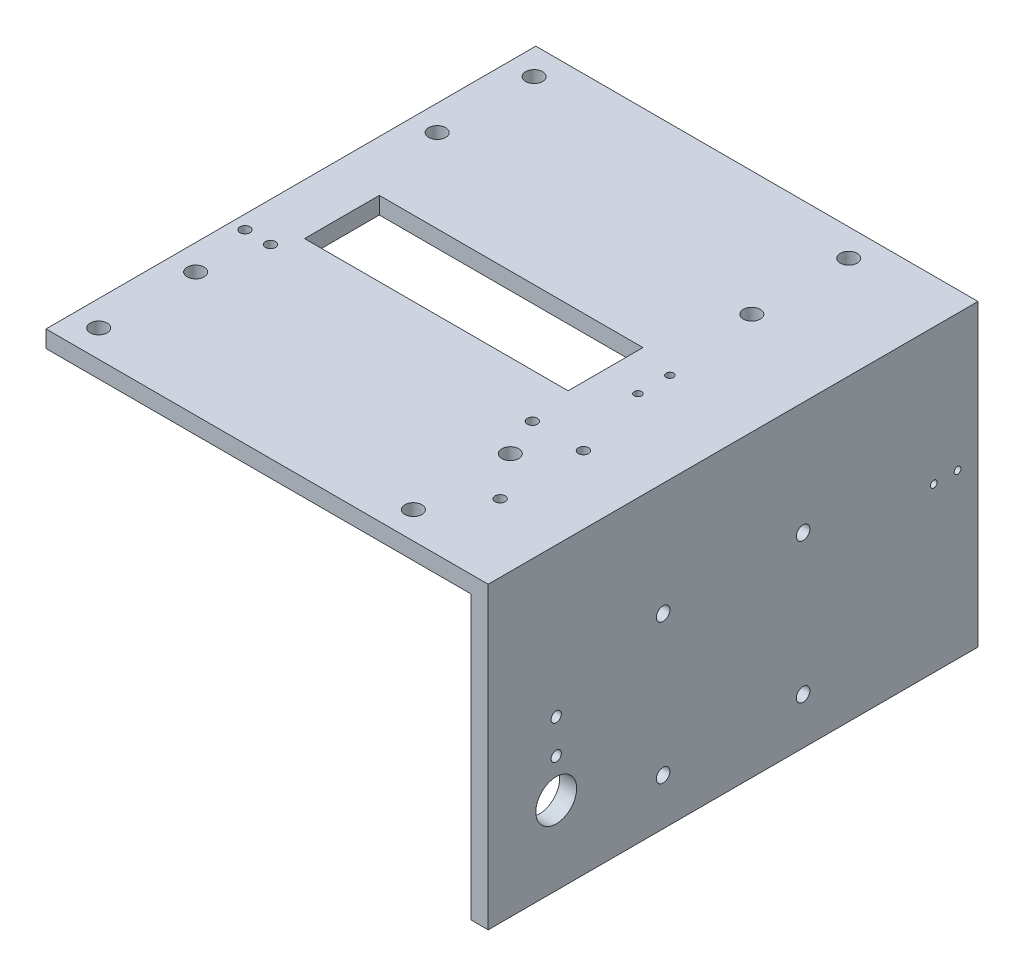
ISO-10303-21;
HEADER;
FILE_DESCRIPTION(('STEP AP214'),'2;1');
FILE_NAME('part.step','',(''),(''),'','','');
FILE_SCHEMA(('AUTOMOTIVE_DESIGN { 1 0 10303 214 1 1 1 1 }'));
ENDSEC;
DATA;
#1=APPLICATION_CONTEXT('core data for automotive mechanical design processes');
#2=APPLICATION_PROTOCOL_DEFINITION('international standard','automotive_design',2000,#1);
#3=PRODUCT_CONTEXT('',#1,'mechanical');
#4=PRODUCT('Part','Part','',(#3));
#5=PRODUCT_RELATED_PRODUCT_CATEGORY('part','',(#4));
#6=PRODUCT_DEFINITION_FORMATION('','',#4);
#7=PRODUCT_DEFINITION_CONTEXT('part definition',#1,'design');
#8=PRODUCT_DEFINITION('design','',#6,#7);
#9=PRODUCT_DEFINITION_SHAPE('','',#8);
#10=(LENGTH_UNIT() NAMED_UNIT(*) SI_UNIT(.MILLI.,.METRE.));
#11=(NAMED_UNIT(*) PLANE_ANGLE_UNIT() SI_UNIT($,.RADIAN.));
#12=(NAMED_UNIT(*) SI_UNIT($,.STERADIAN.) SOLID_ANGLE_UNIT());
#13=UNCERTAINTY_MEASURE_WITH_UNIT(LENGTH_MEASURE(1.E-05),#10,'distance_accuracy_value','');
#14=(GEOMETRIC_REPRESENTATION_CONTEXT(3) GLOBAL_UNCERTAINTY_ASSIGNED_CONTEXT((#13)) GLOBAL_UNIT_ASSIGNED_CONTEXT((#10,
#11,#12)) REPRESENTATION_CONTEXT('',''));
#15=CARTESIAN_POINT('',(0.,0.,0.));
#16=DIRECTION('',(0.,0.,1.));
#17=DIRECTION('',(1.,0.,0.));
#18=AXIS2_PLACEMENT_3D('',#15,#16,#17);
#19=CARTESIAN_POINT('',(-7.5,46.25,72.));
#20=DIRECTION('',(0.,0.,-1.));
#21=DIRECTION('',(-1.,0.,0.));
#22=AXIS2_PLACEMENT_3D('',#19,#20,#21);
#23=PLANE('',#22);
#24=DIRECTION('',(0.,-1.,0.));
#25=VECTOR('',#24,1.);
#26=CARTESIAN_POINT('',(-122.5,53.75,72.));
#27=LINE('',#26,#25);
#28=CARTESIAN_POINT('',(-122.5,53.75,72.));
#29=VERTEX_POINT('',#28);
#30=CARTESIAN_POINT('',(-122.5,48.75,72.));
#31=VERTEX_POINT('',#30);
#32=EDGE_CURVE('E203',#29,#31,#27,.T.);
#33=ORIENTED_EDGE('',*,*,#32,.T.);
#34=DIRECTION('',(-1.,0.,0.));
#35=VECTOR('',#34,1.);
#36=CARTESIAN_POINT('',(2.50000000000001,48.75,72.));
#37=LINE('',#36,#35);
#38=CARTESIAN_POINT('',(2.50000000000001,48.75,72.));
#39=VERTEX_POINT('',#38);
#40=EDGE_CURVE('E119',#39,#31,#37,.T.);
#41=ORIENTED_EDGE('',*,*,#40,.F.);
#42=DIRECTION('',(0.,1.,0.));
#43=VECTOR('',#42,1.);
#44=CARTESIAN_POINT('',(2.50000000000001,-34.25,72.));
#45=LINE('',#44,#43);
#46=CARTESIAN_POINT('',(2.50000000000001,-34.25,72.));
#47=VERTEX_POINT('',#46);
#48=EDGE_CURVE('E113',#47,#39,#45,.T.);
#49=ORIENTED_EDGE('',*,*,#48,.F.);
#50=DIRECTION('',(-1.,0.,0.));
#51=VECTOR('',#50,1.);
#52=CARTESIAN_POINT('',(42.5,-34.25,72.));
#53=LINE('',#52,#51);
#54=CARTESIAN_POINT('',(7.5,-34.25,72.));
#55=VERTEX_POINT('',#54);
#56=EDGE_CURVE('E124',#55,#47,#53,.T.);
#57=ORIENTED_EDGE('',*,*,#56,.F.);
#58=DIRECTION('',(0.,-1.,0.));
#59=VECTOR('',#58,1.);
#60=CARTESIAN_POINT('',(7.5,46.25,72.));
#61=LINE('',#60,#59);
#62=CARTESIAN_POINT('',(7.5,53.75,72.));
#63=VERTEX_POINT('',#62);
#64=EDGE_CURVE('E11',#63,#55,#61,.T.);
#65=ORIENTED_EDGE('',*,*,#64,.F.);
#66=DIRECTION('',(-1.,0.,0.));
#67=VECTOR('',#66,1.);
#68=CARTESIAN_POINT('',(7.5,53.75,72.));
#69=LINE('',#68,#67);
#70=EDGE_CURVE('E198',#63,#29,#69,.T.);
#71=ORIENTED_EDGE('',*,*,#70,.T.);
#72=EDGE_LOOP('',(#33,#41,#49,#57,#65,#71));
#73=FACE_BOUND('',#72,.T.);
#74=ADVANCED_FACE('F33',(#73),#23,.F.);
#75=CARTESIAN_POINT('',(7.5,46.25,72.));
#76=DIRECTION('',(-1.,0.,0.));
#77=DIRECTION('',(0.,0.,1.));
#78=AXIS2_PLACEMENT_3D('',#75,#76,#77);
#79=PLANE('',#78);
#80=CARTESIAN_POINT('',(7.5,13.75,-59.));
#81=DIRECTION('',(1.,0.,0.));
#82=DIRECTION('',(0.,0.,-1.));
#83=AXIS2_PLACEMENT_3D('',#80,#81,#82);
#84=CIRCLE('',#83,0.999999999999998);
#85=CARTESIAN_POINT('',(7.5,13.75,-60.));
#86=VERTEX_POINT('',#85);
#87=EDGE_CURVE('E226',#86,#86,#84,.T.);
#88=ORIENTED_EDGE('',*,*,#87,.F.);
#89=EDGE_LOOP('',(#88));
#90=FACE_BOUND('',#89,.T.);
#91=CARTESIAN_POINT('',(7.5,13.75,-66.));
#92=DIRECTION('',(1.,0.,0.));
#93=DIRECTION('',(0.,0.,-1.));
#94=AXIS2_PLACEMENT_3D('',#91,#92,#93);
#95=CIRCLE('',#94,0.999999999999998);
#96=CARTESIAN_POINT('',(7.5,13.75,-67.));
#97=VERTEX_POINT('',#96);
#98=EDGE_CURVE('E232',#97,#97,#95,.T.);
#99=ORIENTED_EDGE('',*,*,#98,.F.);
#100=EDGE_LOOP('',(#99));
#101=FACE_BOUND('',#100,.T.);
#102=CARTESIAN_POINT('',(7.5,0.,52.));
#103=DIRECTION('',(1.,0.,0.));
#104=DIRECTION('',(0.,0.,-1.));
#105=AXIS2_PLACEMENT_3D('',#102,#103,#104);
#106=CIRCLE('',#105,1.5);
#107=CARTESIAN_POINT('',(7.5,0.,50.5));
#108=VERTEX_POINT('',#107);
#109=EDGE_CURVE('E222',#108,#108,#106,.T.);
#110=ORIENTED_EDGE('',*,*,#109,.F.);
#111=EDGE_LOOP('',(#110));
#112=FACE_BOUND('',#111,.T.);
#113=CARTESIAN_POINT('',(7.5,10.,52.));
#114=DIRECTION('',(1.,0.,0.));
#115=DIRECTION('',(0.,0.,-1.));
#116=AXIS2_PLACEMENT_3D('',#113,#114,#115);
#117=CIRCLE('',#116,1.5);
#118=CARTESIAN_POINT('',(7.5,10.,50.5));
#119=VERTEX_POINT('',#118);
#120=EDGE_CURVE('E230',#119,#119,#117,.T.);
#121=ORIENTED_EDGE('',*,*,#120,.F.);
#122=EDGE_LOOP('',(#121));
#123=FACE_BOUND('',#122,.T.);
#124=CARTESIAN_POINT('',(7.5,-20.575,20.575));
#125=DIRECTION('',(-1.,0.,0.));
#126=DIRECTION('',(0.,-1.,0.));
#127=AXIS2_PLACEMENT_3D('',#124,#125,#126);
#128=CIRCLE('',#127,2.);
#129=CARTESIAN_POINT('',(7.5,-22.575,20.575));
#130=VERTEX_POINT('',#129);
#131=EDGE_CURVE('E321',#130,#130,#128,.T.);
#132=ORIENTED_EDGE('',*,*,#131,.T.);
#133=EDGE_LOOP('',(#132));
#134=FACE_BOUND('',#133,.T.);
#135=CARTESIAN_POINT('',(7.5,20.575,20.575));
#136=DIRECTION('',(-1.,0.,0.));
#137=DIRECTION('',(0.,-1.,0.));
#138=AXIS2_PLACEMENT_3D('',#135,#136,#137);
#139=CIRCLE('',#138,2.);
#140=CARTESIAN_POINT('',(7.5,18.575,20.575));
#141=VERTEX_POINT('',#140);
#142=EDGE_CURVE('E329',#141,#141,#139,.T.);
#143=ORIENTED_EDGE('',*,*,#142,.T.);
#144=EDGE_LOOP('',(#143));
#145=FACE_BOUND('',#144,.T.);
#146=CARTESIAN_POINT('',(7.5,20.575,-20.575));
#147=DIRECTION('',(-1.,0.,0.));
#148=DIRECTION('',(0.,-1.,0.));
#149=AXIS2_PLACEMENT_3D('',#146,#147,#148);
#150=CIRCLE('',#149,2.);
#151=CARTESIAN_POINT('',(7.5,18.575,-20.575));
#152=VERTEX_POINT('',#151);
#153=EDGE_CURVE('E135',#152,#152,#150,.T.);
#154=ORIENTED_EDGE('',*,*,#153,.T.);
#155=EDGE_LOOP('',(#154));
#156=FACE_BOUND('',#155,.T.);
#157=CARTESIAN_POINT('',(7.5,-20.575,-20.575));
#158=DIRECTION('',(-1.,0.,0.));
#159=DIRECTION('',(0.,-1.,0.));
#160=AXIS2_PLACEMENT_3D('',#157,#158,#159);
#161=CIRCLE('',#160,2.00000000000001);
#162=CARTESIAN_POINT('',(7.5,-22.575,-20.575));
#163=VERTEX_POINT('',#162);
#164=EDGE_CURVE('E131',#163,#163,#161,.T.);
#165=ORIENTED_EDGE('',*,*,#164,.T.);
#166=EDGE_LOOP('',(#165));
#167=FACE_BOUND('',#166,.T.);
#168=CARTESIAN_POINT('',(7.49999999999999,-11.25,52.));
#169=DIRECTION('',(-1.,0.,0.));
#170=DIRECTION('',(0.,0.,1.));
#171=AXIS2_PLACEMENT_3D('',#168,#169,#170);
#172=CIRCLE('',#171,6.);
#173=CARTESIAN_POINT('',(7.49999999999999,-11.25,58.));
#174=VERTEX_POINT('',#173);
#175=EDGE_CURVE('E169',#174,#174,#172,.T.);
#176=ORIENTED_EDGE('',*,*,#175,.T.);
#177=EDGE_LOOP('',(#176));
#178=FACE_BOUND('',#177,.T.);
#179=ORIENTED_EDGE('',*,*,#64,.T.);
#180=DIRECTION('',(0.,0.,-1.));
#181=VECTOR('',#180,1.);
#182=CARTESIAN_POINT('',(7.5,-34.25,72.));
#183=LINE('',#182,#181);
#184=CARTESIAN_POINT('',(7.5,-34.25,-72.));
#185=VERTEX_POINT('',#184);
#186=EDGE_CURVE('E129',#55,#185,#183,.T.);
#187=ORIENTED_EDGE('',*,*,#186,.T.);
#188=DIRECTION('',(0.,-1.,0.));
#189=VECTOR('',#188,1.);
#190=CARTESIAN_POINT('',(7.5,46.25,-72.));
#191=LINE('',#190,#189);
#192=CARTESIAN_POINT('',(7.5,53.75,-72.));
#193=VERTEX_POINT('',#192);
#194=EDGE_CURVE('E41',#193,#185,#191,.T.);
#195=ORIENTED_EDGE('',*,*,#194,.F.);
#196=DIRECTION('',(0.,0.,1.));
#197=VECTOR('',#196,1.);
#198=CARTESIAN_POINT('',(7.5,53.75,-72.));
#199=LINE('',#198,#197);
#200=EDGE_CURVE('E195',#193,#63,#199,.T.);
#201=ORIENTED_EDGE('',*,*,#200,.T.);
#202=EDGE_LOOP('',(#179,#187,#195,#201));
#203=FACE_BOUND('',#202,.T.);
#204=ADVANCED_FACE('F335',(#90,#101,#112,#123,#134,#145,#156,#167,#178,#203),#79,.F.);
#205=CARTESIAN_POINT('',(-7.5,46.25,-72.));
#206=DIRECTION('',(0.,0.,1.));
#207=DIRECTION('',(1.,0.,0.));
#208=AXIS2_PLACEMENT_3D('',#205,#206,#207);
#209=PLANE('',#208);
#210=DIRECTION('',(0.,1.,0.));
#211=VECTOR('',#210,1.);
#212=CARTESIAN_POINT('',(2.50000000000001,46.25,-72.));
#213=LINE('',#212,#211);
#214=CARTESIAN_POINT('',(2.50000000000001,-34.25,-72.));
#215=VERTEX_POINT('',#214);
#216=CARTESIAN_POINT('',(2.50000000000001,48.75,-72.));
#217=VERTEX_POINT('',#216);
#218=EDGE_CURVE('E57',#215,#217,#213,.T.);
#219=ORIENTED_EDGE('',*,*,#218,.T.);
#220=DIRECTION('',(-1.,0.,0.));
#221=VECTOR('',#220,1.);
#222=CARTESIAN_POINT('',(-7.5,48.75,-72.));
#223=LINE('',#222,#221);
#224=CARTESIAN_POINT('',(-122.5,48.75,-72.));
#225=VERTEX_POINT('',#224);
#226=EDGE_CURVE('E218',#217,#225,#223,.T.);
#227=ORIENTED_EDGE('',*,*,#226,.T.);
#228=DIRECTION('',(0.,-1.,0.));
#229=VECTOR('',#228,1.);
#230=CARTESIAN_POINT('',(-122.5,53.75,-72.));
#231=LINE('',#230,#229);
#232=CARTESIAN_POINT('',(-122.5,53.75,-72.));
#233=VERTEX_POINT('',#232);
#234=EDGE_CURVE('E204',#233,#225,#231,.T.);
#235=ORIENTED_EDGE('',*,*,#234,.F.);
#236=DIRECTION('',(1.,0.,0.));
#237=VECTOR('',#236,1.);
#238=CARTESIAN_POINT('',(-22.5,53.75,-72.));
#239=LINE('',#238,#237);
#240=EDGE_CURVE('E187',#233,#193,#239,.T.);
#241=ORIENTED_EDGE('',*,*,#240,.T.);
#242=ORIENTED_EDGE('',*,*,#194,.T.);
#243=DIRECTION('',(-1.,0.,0.));
#244=VECTOR('',#243,1.);
#245=CARTESIAN_POINT('',(42.5,-34.25,-72.));
#246=LINE('',#245,#244);
#247=EDGE_CURVE('E130',#185,#215,#246,.T.);
#248=ORIENTED_EDGE('',*,*,#247,.T.);
#249=EDGE_LOOP('',(#219,#227,#235,#241,#242,#248));
#250=FACE_BOUND('',#249,.T.);
#251=ADVANCED_FACE('F360',(#250),#209,.F.);
#252=CARTESIAN_POINT('',(-122.5,53.75,72.));
#253=DIRECTION('',(-1.,0.,0.));
#254=DIRECTION('',(0.,0.,1.));
#255=AXIS2_PLACEMENT_3D('',#252,#253,#254);
#256=PLANE('',#255);
#257=DIRECTION('',(0.,0.,-1.));
#258=VECTOR('',#257,1.);
#259=CARTESIAN_POINT('',(-122.5,48.75,72.));
#260=LINE('',#259,#258);
#261=EDGE_CURVE('E295',#31,#225,#260,.T.);
#262=ORIENTED_EDGE('',*,*,#261,.F.);
#263=ORIENTED_EDGE('',*,*,#32,.F.);
#264=DIRECTION('',(0.,0.,-1.));
#265=VECTOR('',#264,1.);
#266=CARTESIAN_POINT('',(-122.5,53.75,72.));
#267=LINE('',#266,#265);
#268=EDGE_CURVE('E200',#29,#233,#267,.T.);
#269=ORIENTED_EDGE('',*,*,#268,.T.);
#270=ORIENTED_EDGE('',*,*,#234,.T.);
#271=EDGE_LOOP('',(#262,#263,#269,#270));
#272=FACE_BOUND('',#271,.T.);
#273=ADVANCED_FACE('F366',(#272),#256,.T.);
#274=CARTESIAN_POINT('',(0.,53.75,0.));
#275=DIRECTION('',(0.,-1.,0.));
#276=DIRECTION('',(0.,0.,-1.));
#277=AXIS2_PLACEMENT_3D('',#274,#275,#276);
#278=PLANE('',#277);
#279=CARTESIAN_POINT('',(-111.,53.75,17.5));
#280=DIRECTION('',(0.,1.,0.));
#281=DIRECTION('',(0.,0.,1.));
#282=AXIS2_PLACEMENT_3D('',#279,#280,#281);
#283=CIRCLE('',#282,1.5);
#284=CARTESIAN_POINT('',(-111.,53.75,19.));
#285=VERTEX_POINT('',#284);
#286=EDGE_CURVE('E312',#285,#285,#283,.T.);
#287=ORIENTED_EDGE('',*,*,#286,.F.);
#288=EDGE_LOOP('',(#287));
#289=FACE_BOUND('',#288,.T.);
#290=CARTESIAN_POINT('',(-118.5,53.75,17.5));
#291=DIRECTION('',(0.,1.,0.));
#292=DIRECTION('',(0.,0.,1.));
#293=AXIS2_PLACEMENT_3D('',#290,#291,#292);
#294=CIRCLE('',#293,1.5);
#295=CARTESIAN_POINT('',(-118.5,53.75,19.));
#296=VERTEX_POINT('',#295);
#297=EDGE_CURVE('E311',#296,#296,#294,.T.);
#298=ORIENTED_EDGE('',*,*,#297,.F.);
#299=EDGE_LOOP('',(#298));
#300=FACE_BOUND('',#299,.T.);
#301=CARTESIAN_POINT('',(-12.5,53.75,48.5));
#302=DIRECTION('',(0.,-1.,0.));
#303=DIRECTION('',(0.,0.,-1.));
#304=AXIS2_PLACEMENT_3D('',#301,#302,#303);
#305=CIRCLE('',#304,1.5);
#306=CARTESIAN_POINT('',(-12.5,53.75,47.));
#307=VERTEX_POINT('',#306);
#308=EDGE_CURVE('E318',#307,#307,#305,.T.);
#309=ORIENTED_EDGE('',*,*,#308,.T.);
#310=EDGE_LOOP('',(#309));
#311=FACE_BOUND('',#310,.T.);
#312=CARTESIAN_POINT('',(-12.5,53.75,24.));
#313=DIRECTION('',(0.,-1.,0.));
#314=DIRECTION('',(0.,0.,-1.));
#315=AXIS2_PLACEMENT_3D('',#312,#313,#314);
#316=CIRCLE('',#315,1.5);
#317=CARTESIAN_POINT('',(-12.5,53.75,22.5));
#318=VERTEX_POINT('',#317);
#319=EDGE_CURVE('E322',#318,#318,#316,.T.);
#320=ORIENTED_EDGE('',*,*,#319,.T.);
#321=EDGE_LOOP('',(#320));
#322=FACE_BOUND('',#321,.T.);
#323=CARTESIAN_POINT('',(-27.5,53.75,24.));
#324=DIRECTION('',(0.,-1.,0.));
#325=DIRECTION('',(0.,0.,-1.));
#326=AXIS2_PLACEMENT_3D('',#323,#324,#325);
#327=CIRCLE('',#326,1.5);
#328=CARTESIAN_POINT('',(-27.5,53.75,22.5));
#329=VERTEX_POINT('',#328);
#330=EDGE_CURVE('E315',#329,#329,#327,.T.);
#331=ORIENTED_EDGE('',*,*,#330,.T.);
#332=EDGE_LOOP('',(#331));
#333=FACE_BOUND('',#332,.T.);
#334=CARTESIAN_POINT('',(-19.,53.75,-7.90000000000001));
#335=DIRECTION('',(0.,1.,0.));
#336=DIRECTION('',(0.,0.,1.));
#337=AXIS2_PLACEMENT_3D('',#334,#335,#336);
#338=CIRCLE('',#337,1.1);
#339=CARTESIAN_POINT('',(-19.,53.75,-6.80000000000001));
#340=VERTEX_POINT('',#339);
#341=EDGE_CURVE('E140',#340,#340,#338,.T.);
#342=ORIENTED_EDGE('',*,*,#341,.F.);
#343=EDGE_LOOP('',(#342));
#344=FACE_BOUND('',#343,.T.);
#345=CARTESIAN_POINT('',(-19.,53.75,1.47999999999999));
#346=DIRECTION('',(0.,1.,0.));
#347=DIRECTION('',(0.,0.,1.));
#348=AXIS2_PLACEMENT_3D('',#345,#346,#347);
#349=CIRCLE('',#348,1.1);
#350=CARTESIAN_POINT('',(-19.,53.75,2.57999999999999));
#351=VERTEX_POINT('',#350);
#352=EDGE_CURVE('E139',#351,#351,#349,.T.);
#353=ORIENTED_EDGE('',*,*,#352,.F.);
#354=EDGE_LOOP('',(#353));
#355=FACE_BOUND('',#354,.T.);
#356=CARTESIAN_POINT('',(-22.5,53.75,-64.));
#357=DIRECTION('',(0.,1.,0.));
#358=DIRECTION('',(0.,0.,1.));
#359=AXIS2_PLACEMENT_3D('',#356,#357,#358);
#360=CIRCLE('',#359,2.5);
#361=CARTESIAN_POINT('',(-22.5,53.75,-61.5));
#362=VERTEX_POINT('',#361);
#363=EDGE_CURVE('E149',#362,#362,#360,.T.);
#364=ORIENTED_EDGE('',*,*,#363,.F.);
#365=EDGE_LOOP('',(#364));
#366=FACE_BOUND('',#365,.T.);
#367=CARTESIAN_POINT('',(-22.5,53.75,64.));
#368=DIRECTION('',(0.,1.,0.));
#369=DIRECTION('',(0.,0.,-1.));
#370=AXIS2_PLACEMENT_3D('',#367,#368,#369);
#371=CIRCLE('',#370,2.5);
#372=CARTESIAN_POINT('',(-22.5,53.75,61.5));
#373=VERTEX_POINT('',#372);
#374=EDGE_CURVE('E155',#373,#373,#371,.T.);
#375=ORIENTED_EDGE('',*,*,#374,.F.);
#376=EDGE_LOOP('',(#375));
#377=FACE_BOUND('',#376,.T.);
#378=CARTESIAN_POINT('',(-22.5,53.75,35.5));
#379=DIRECTION('',(0.,1.,0.));
#380=DIRECTION('',(0.,0.,-1.));
#381=AXIS2_PLACEMENT_3D('',#378,#379,#380);
#382=CIRCLE('',#381,2.5);
#383=CARTESIAN_POINT('',(-22.5,53.75,33.));
#384=VERTEX_POINT('',#383);
#385=EDGE_CURVE('E158',#384,#384,#382,.T.);
#386=ORIENTED_EDGE('',*,*,#385,.F.);
#387=EDGE_LOOP('',(#386));
#388=FACE_BOUND('',#387,.T.);
#389=CARTESIAN_POINT('',(-115.,53.75,35.5));
#390=DIRECTION('',(0.,1.,0.));
#391=DIRECTION('',(0.,0.,1.));
#392=AXIS2_PLACEMENT_3D('',#389,#390,#391);
#393=CIRCLE('',#392,2.5);
#394=CARTESIAN_POINT('',(-115.,53.75,38.));
#395=VERTEX_POINT('',#394);
#396=EDGE_CURVE('E161',#395,#395,#393,.T.);
#397=ORIENTED_EDGE('',*,*,#396,.F.);
#398=EDGE_LOOP('',(#397));
#399=FACE_BOUND('',#398,.T.);
#400=CARTESIAN_POINT('',(-22.5,53.75,-35.5));
#401=DIRECTION('',(0.,1.,0.));
#402=DIRECTION('',(0.,0.,1.));
#403=AXIS2_PLACEMENT_3D('',#400,#401,#402);
#404=CIRCLE('',#403,2.5);
#405=CARTESIAN_POINT('',(-22.5,53.75,-33.));
#406=VERTEX_POINT('',#405);
#407=EDGE_CURVE('E146',#406,#406,#404,.T.);
#408=ORIENTED_EDGE('',*,*,#407,.F.);
#409=EDGE_LOOP('',(#408));
#410=FACE_BOUND('',#409,.T.);
#411=CARTESIAN_POINT('',(-115.,53.75,-35.5));
#412=DIRECTION('',(0.,1.,0.));
#413=DIRECTION('',(0.,0.,-1.));
#414=AXIS2_PLACEMENT_3D('',#411,#412,#413);
#415=CIRCLE('',#414,2.5);
#416=CARTESIAN_POINT('',(-115.,53.75,-38.));
#417=VERTEX_POINT('',#416);
#418=EDGE_CURVE('E150',#417,#417,#415,.T.);
#419=ORIENTED_EDGE('',*,*,#418,.F.);
#420=EDGE_LOOP('',(#419));
#421=FACE_BOUND('',#420,.T.);
#422=CARTESIAN_POINT('',(-115.,53.75,-64.));
#423=DIRECTION('',(0.,1.,0.));
#424=DIRECTION('',(0.,0.,-1.));
#425=AXIS2_PLACEMENT_3D('',#422,#423,#424);
#426=CIRCLE('',#425,2.5);
#427=CARTESIAN_POINT('',(-115.,53.75,-66.5));
#428=VERTEX_POINT('',#427);
#429=EDGE_CURVE('E143',#428,#428,#426,.T.);
#430=ORIENTED_EDGE('',*,*,#429,.F.);
#431=EDGE_LOOP('',(#430));
#432=FACE_BOUND('',#431,.T.);
#433=CARTESIAN_POINT('',(-115.,53.75,64.));
#434=DIRECTION('',(0.,1.,0.));
#435=DIRECTION('',(0.,0.,1.));
#436=AXIS2_PLACEMENT_3D('',#433,#434,#435);
#437=CIRCLE('',#436,2.5);
#438=CARTESIAN_POINT('',(-115.,53.75,66.5));
#439=VERTEX_POINT('',#438);
#440=EDGE_CURVE('E164',#439,#439,#437,.T.);
#441=ORIENTED_EDGE('',*,*,#440,.F.);
#442=EDGE_LOOP('',(#441));
#443=FACE_BOUND('',#442,.T.);
#444=DIRECTION('',(1.,0.,0.));
#445=VECTOR('',#444,1.);
#446=CARTESIAN_POINT('',(-30.,53.75,11.));
#447=LINE('',#446,#445);
#448=CARTESIAN_POINT('',(-107.5,53.75,11.));
#449=VERTEX_POINT('',#448);
#450=CARTESIAN_POINT('',(-30.,53.75,11.));
#451=VERTEX_POINT('',#450);
#452=EDGE_CURVE('E175',#449,#451,#447,.T.);
#453=ORIENTED_EDGE('',*,*,#452,.F.);
#454=DIRECTION('',(0.,0.,1.));
#455=VECTOR('',#454,1.);
#456=CARTESIAN_POINT('',(-107.5,53.75,11.));
#457=LINE('',#456,#455);
#458=CARTESIAN_POINT('',(-107.5,53.75,-11.));
#459=VERTEX_POINT('',#458);
#460=EDGE_CURVE('E172',#459,#449,#457,.T.);
#461=ORIENTED_EDGE('',*,*,#460,.F.);
#462=DIRECTION('',(-1.,0.,0.));
#463=VECTOR('',#462,1.);
#464=CARTESIAN_POINT('',(-30.,53.75,-11.));
#465=LINE('',#464,#463);
#466=CARTESIAN_POINT('',(-30.,53.75,-11.));
#467=VERTEX_POINT('',#466);
#468=EDGE_CURVE('E181',#467,#459,#465,.T.);
#469=ORIENTED_EDGE('',*,*,#468,.F.);
#470=DIRECTION('',(0.,0.,-1.));
#471=VECTOR('',#470,1.);
#472=CARTESIAN_POINT('',(-30.,53.75,11.));
#473=LINE('',#472,#471);
#474=EDGE_CURVE('E178',#451,#467,#473,.T.);
#475=ORIENTED_EDGE('',*,*,#474,.F.);
#476=EDGE_LOOP('',(#453,#461,#469,#475));
#477=FACE_BOUND('',#476,.T.);
#478=ORIENTED_EDGE('',*,*,#240,.F.);
#479=ORIENTED_EDGE('',*,*,#268,.F.);
#480=ORIENTED_EDGE('',*,*,#70,.F.);
#481=ORIENTED_EDGE('',*,*,#200,.F.);
#482=EDGE_LOOP('',(#478,#479,#480,#481));
#483=FACE_BOUND('',#482,.T.);
#484=ADVANCED_FACE('F373',(#289,#300,#311,#322,#333,#344,#355,#366,#377,#388,#399,#410,#421,
#432,#443,#477,#483),#278,.F.);
#485=CARTESIAN_POINT('',(-107.5,23.75,11.));
#486=DIRECTION('',(-1.,0.,0.));
#487=DIRECTION('',(0.,0.,1.));
#488=AXIS2_PLACEMENT_3D('',#485,#486,#487);
#489=PLANE('',#488);
#490=DIRECTION('',(0.,1.,0.));
#491=VECTOR('',#490,1.);
#492=CARTESIAN_POINT('',(-107.5,23.75,11.));
#493=LINE('',#492,#491);
#494=CARTESIAN_POINT('',(-107.5,48.75,11.));
#495=VERTEX_POINT('',#494);
#496=EDGE_CURVE('E184',#495,#449,#493,.T.);
#497=ORIENTED_EDGE('',*,*,#496,.F.);
#498=DIRECTION('',(0.,0.,-1.));
#499=VECTOR('',#498,1.);
#500=CARTESIAN_POINT('',(-107.5,48.75,11.));
#501=LINE('',#500,#499);
#502=CARTESIAN_POINT('',(-107.5,48.75,-11.));
#503=VERTEX_POINT('',#502);
#504=EDGE_CURVE('E49',#495,#503,#501,.T.);
#505=ORIENTED_EDGE('',*,*,#504,.T.);
#506=DIRECTION('',(0.,1.,0.));
#507=VECTOR('',#506,1.);
#508=CARTESIAN_POINT('',(-107.5,23.75,-11.));
#509=LINE('',#508,#507);
#510=EDGE_CURVE('E185',#503,#459,#509,.T.);
#511=ORIENTED_EDGE('',*,*,#510,.T.);
#512=ORIENTED_EDGE('',*,*,#460,.T.);
#513=EDGE_LOOP('',(#497,#505,#511,#512));
#514=FACE_BOUND('',#513,.T.);
#515=ADVANCED_FACE('F377',(#514),#489,.F.);
#516=CARTESIAN_POINT('',(-30.,23.75,-11.));
#517=DIRECTION('',(0.,0.,-1.));
#518=DIRECTION('',(-1.,0.,0.));
#519=AXIS2_PLACEMENT_3D('',#516,#517,#518);
#520=PLANE('',#519);
#521=ORIENTED_EDGE('',*,*,#510,.F.);
#522=DIRECTION('',(1.,0.,0.));
#523=VECTOR('',#522,1.);
#524=CARTESIAN_POINT('',(-30.,48.75,-11.));
#525=LINE('',#524,#523);
#526=CARTESIAN_POINT('',(-30.,48.75,-11.));
#527=VERTEX_POINT('',#526);
#528=EDGE_CURVE('E291',#503,#527,#525,.T.);
#529=ORIENTED_EDGE('',*,*,#528,.T.);
#530=DIRECTION('',(0.,1.,0.));
#531=VECTOR('',#530,1.);
#532=CARTESIAN_POINT('',(-30.,23.75,-11.));
#533=LINE('',#532,#531);
#534=EDGE_CURVE('E188',#527,#467,#533,.T.);
#535=ORIENTED_EDGE('',*,*,#534,.T.);
#536=ORIENTED_EDGE('',*,*,#468,.T.);
#537=EDGE_LOOP('',(#521,#529,#535,#536));
#538=FACE_BOUND('',#537,.T.);
#539=ADVANCED_FACE('F381',(#538),#520,.F.);
#540=CARTESIAN_POINT('',(-30.,23.75,11.));
#541=DIRECTION('',(1.,0.,0.));
#542=DIRECTION('',(0.,0.,-1.));
#543=AXIS2_PLACEMENT_3D('',#540,#541,#542);
#544=PLANE('',#543);
#545=ORIENTED_EDGE('',*,*,#534,.F.);
#546=DIRECTION('',(0.,0.,1.));
#547=VECTOR('',#546,1.);
#548=CARTESIAN_POINT('',(-30.,48.75,11.));
#549=LINE('',#548,#547);
#550=CARTESIAN_POINT('',(-30.,48.75,11.));
#551=VERTEX_POINT('',#550);
#552=EDGE_CURVE('E288',#527,#551,#549,.T.);
#553=ORIENTED_EDGE('',*,*,#552,.T.);
#554=DIRECTION('',(0.,1.,0.));
#555=VECTOR('',#554,1.);
#556=CARTESIAN_POINT('',(-30.,23.75,11.));
#557=LINE('',#556,#555);
#558=EDGE_CURVE('E190',#551,#451,#557,.T.);
#559=ORIENTED_EDGE('',*,*,#558,.T.);
#560=ORIENTED_EDGE('',*,*,#474,.T.);
#561=EDGE_LOOP('',(#545,#553,#559,#560));
#562=FACE_BOUND('',#561,.T.);
#563=ADVANCED_FACE('F387',(#562),#544,.F.);
#564=CARTESIAN_POINT('',(-30.,23.75,11.));
#565=DIRECTION('',(0.,0.,1.));
#566=DIRECTION('',(1.,0.,0.));
#567=AXIS2_PLACEMENT_3D('',#564,#565,#566);
#568=PLANE('',#567);
#569=ORIENTED_EDGE('',*,*,#558,.F.);
#570=DIRECTION('',(-1.,0.,0.));
#571=VECTOR('',#570,1.);
#572=CARTESIAN_POINT('',(-30.,48.75,11.));
#573=LINE('',#572,#571);
#574=EDGE_CURVE('E286',#551,#495,#573,.T.);
#575=ORIENTED_EDGE('',*,*,#574,.T.);
#576=ORIENTED_EDGE('',*,*,#496,.T.);
#577=ORIENTED_EDGE('',*,*,#452,.T.);
#578=EDGE_LOOP('',(#569,#575,#576,#577));
#579=FACE_BOUND('',#578,.T.);
#580=ADVANCED_FACE('F383',(#579),#568,.F.);
#581=CARTESIAN_POINT('',(7.49999999999999,-11.25,52.));
#582=DIRECTION('',(-1.,0.,0.));
#583=DIRECTION('',(0.,0.,1.));
#584=AXIS2_PLACEMENT_3D('',#581,#582,#583);
#585=CYLINDRICAL_SURFACE('',#584,6.);
#586=CARTESIAN_POINT('',(2.50000000000001,-11.25,52.));
#587=DIRECTION('',(1.,0.,0.));
#588=DIRECTION('',(0.,0.,-1.));
#589=AXIS2_PLACEMENT_3D('',#586,#587,#588);
#590=CIRCLE('',#589,6.);
#591=CARTESIAN_POINT('',(2.50000000000001,-11.25,46.));
#592=VERTEX_POINT('',#591);
#593=EDGE_CURVE('E307',#592,#592,#590,.F.);
#594=ORIENTED_EDGE('',*,*,#593,.T.);
#595=EDGE_LOOP('',(#594));
#596=FACE_BOUND('',#595,.T.);
#597=ORIENTED_EDGE('',*,*,#175,.F.);
#598=EDGE_LOOP('',(#597));
#599=FACE_BOUND('',#598,.T.);
#600=ADVANCED_FACE('F386',(#596,#599),#585,.F.);
#601=CARTESIAN_POINT('',(-115.,18.75,64.));
#602=DIRECTION('',(0.,1.,0.));
#603=DIRECTION('',(0.,0.,1.));
#604=AXIS2_PLACEMENT_3D('',#601,#602,#603);
#605=CYLINDRICAL_SURFACE('',#604,2.5);
#606=CARTESIAN_POINT('',(-115.,48.75,64.));
#607=DIRECTION('',(0.,1.,0.));
#608=DIRECTION('',(-1.,0.,0.));
#609=AXIS2_PLACEMENT_3D('',#606,#607,#608);
#610=CIRCLE('',#609,2.5);
#611=CARTESIAN_POINT('',(-117.5,48.75,64.));
#612=VERTEX_POINT('',#611);
#613=EDGE_CURVE('E283',#612,#612,#610,.F.);
#614=ORIENTED_EDGE('',*,*,#613,.T.);
#615=EDGE_LOOP('',(#614));
#616=FACE_BOUND('',#615,.T.);
#617=ORIENTED_EDGE('',*,*,#440,.T.);
#618=EDGE_LOOP('',(#617));
#619=FACE_BOUND('',#618,.T.);
#620=ADVANCED_FACE('F397',(#616,#619),#605,.F.);
#621=CARTESIAN_POINT('',(-115.,18.75,-64.));
#622=DIRECTION('',(0.,1.,0.));
#623=DIRECTION('',(0.,0.,1.));
#624=AXIS2_PLACEMENT_3D('',#621,#622,#623);
#625=CYLINDRICAL_SURFACE('',#624,2.5);
#626=CARTESIAN_POINT('',(-115.,48.75,-64.));
#627=DIRECTION('',(0.,1.,0.));
#628=DIRECTION('',(-1.,0.,0.));
#629=AXIS2_PLACEMENT_3D('',#626,#627,#628);
#630=CIRCLE('',#629,2.5);
#631=CARTESIAN_POINT('',(-117.5,48.75,-64.));
#632=VERTEX_POINT('',#631);
#633=EDGE_CURVE('E280',#632,#632,#630,.F.);
#634=ORIENTED_EDGE('',*,*,#633,.T.);
#635=EDGE_LOOP('',(#634));
#636=FACE_BOUND('',#635,.T.);
#637=ORIENTED_EDGE('',*,*,#429,.T.);
#638=EDGE_LOOP('',(#637));
#639=FACE_BOUND('',#638,.T.);
#640=ADVANCED_FACE('F401',(#636,#639),#625,.F.);
#641=CARTESIAN_POINT('',(-115.,18.75,-35.5));
#642=DIRECTION('',(0.,1.,0.));
#643=DIRECTION('',(0.,0.,1.));
#644=AXIS2_PLACEMENT_3D('',#641,#642,#643);
#645=CYLINDRICAL_SURFACE('',#644,2.5);
#646=CARTESIAN_POINT('',(-115.,48.75,-35.5));
#647=DIRECTION('',(0.,1.,0.));
#648=DIRECTION('',(-1.,0.,0.));
#649=AXIS2_PLACEMENT_3D('',#646,#647,#648);
#650=CIRCLE('',#649,2.5);
#651=CARTESIAN_POINT('',(-117.5,48.75,-35.5));
#652=VERTEX_POINT('',#651);
#653=EDGE_CURVE('E277',#652,#652,#650,.F.);
#654=ORIENTED_EDGE('',*,*,#653,.T.);
#655=EDGE_LOOP('',(#654));
#656=FACE_BOUND('',#655,.T.);
#657=ORIENTED_EDGE('',*,*,#418,.T.);
#658=EDGE_LOOP('',(#657));
#659=FACE_BOUND('',#658,.T.);
#660=ADVANCED_FACE('F423',(#656,#659),#645,.F.);
#661=CARTESIAN_POINT('',(-22.5,18.75,-35.5));
#662=DIRECTION('',(0.,1.,0.));
#663=DIRECTION('',(0.,0.,1.));
#664=AXIS2_PLACEMENT_3D('',#661,#662,#663);
#665=CYLINDRICAL_SURFACE('',#664,2.5);
#666=CARTESIAN_POINT('',(-22.5,48.75,-35.5));
#667=DIRECTION('',(0.,1.,0.));
#668=DIRECTION('',(-1.,0.,0.));
#669=AXIS2_PLACEMENT_3D('',#666,#667,#668);
#670=CIRCLE('',#669,2.5);
#671=CARTESIAN_POINT('',(-25.,48.75,-35.5));
#672=VERTEX_POINT('',#671);
#673=EDGE_CURVE('E274',#672,#672,#670,.F.);
#674=ORIENTED_EDGE('',*,*,#673,.T.);
#675=EDGE_LOOP('',(#674));
#676=FACE_BOUND('',#675,.T.);
#677=ORIENTED_EDGE('',*,*,#407,.T.);
#678=EDGE_LOOP('',(#677));
#679=FACE_BOUND('',#678,.T.);
#680=ADVANCED_FACE('F411',(#676,#679),#665,.F.);
#681=CARTESIAN_POINT('',(-115.,18.75,35.5));
#682=DIRECTION('',(0.,1.,0.));
#683=DIRECTION('',(0.,0.,1.));
#684=AXIS2_PLACEMENT_3D('',#681,#682,#683);
#685=CYLINDRICAL_SURFACE('',#684,2.5);
#686=CARTESIAN_POINT('',(-115.,48.75,35.5));
#687=DIRECTION('',(0.,1.,0.));
#688=DIRECTION('',(-1.,0.,0.));
#689=AXIS2_PLACEMENT_3D('',#686,#687,#688);
#690=CIRCLE('',#689,2.5);
#691=CARTESIAN_POINT('',(-117.5,48.75,35.5));
#692=VERTEX_POINT('',#691);
#693=EDGE_CURVE('E271',#692,#692,#690,.F.);
#694=ORIENTED_EDGE('',*,*,#693,.T.);
#695=EDGE_LOOP('',(#694));
#696=FACE_BOUND('',#695,.T.);
#697=ORIENTED_EDGE('',*,*,#396,.T.);
#698=EDGE_LOOP('',(#697));
#699=FACE_BOUND('',#698,.T.);
#700=ADVANCED_FACE('F407',(#696,#699),#685,.F.);
#701=CARTESIAN_POINT('',(-22.5,18.75,35.5));
#702=DIRECTION('',(0.,1.,0.));
#703=DIRECTION('',(0.,0.,1.));
#704=AXIS2_PLACEMENT_3D('',#701,#702,#703);
#705=CYLINDRICAL_SURFACE('',#704,2.5);
#706=CARTESIAN_POINT('',(-22.5,48.75,35.5));
#707=DIRECTION('',(0.,1.,0.));
#708=DIRECTION('',(-1.,0.,0.));
#709=AXIS2_PLACEMENT_3D('',#706,#707,#708);
#710=CIRCLE('',#709,2.5);
#711=CARTESIAN_POINT('',(-25.,48.75,35.5));
#712=VERTEX_POINT('',#711);
#713=EDGE_CURVE('E268',#712,#712,#710,.F.);
#714=ORIENTED_EDGE('',*,*,#713,.T.);
#715=EDGE_LOOP('',(#714));
#716=FACE_BOUND('',#715,.T.);
#717=ORIENTED_EDGE('',*,*,#385,.T.);
#718=EDGE_LOOP('',(#717));
#719=FACE_BOUND('',#718,.T.);
#720=ADVANCED_FACE('F403',(#716,#719),#705,.F.);
#721=CARTESIAN_POINT('',(-22.5,18.75,64.));
#722=DIRECTION('',(0.,1.,0.));
#723=DIRECTION('',(0.,0.,1.));
#724=AXIS2_PLACEMENT_3D('',#721,#722,#723);
#725=CYLINDRICAL_SURFACE('',#724,2.5);
#726=CARTESIAN_POINT('',(-22.5,48.75,64.));
#727=DIRECTION('',(0.,1.,0.));
#728=DIRECTION('',(-1.,0.,0.));
#729=AXIS2_PLACEMENT_3D('',#726,#727,#728);
#730=CIRCLE('',#729,2.5);
#731=CARTESIAN_POINT('',(-25.,48.75,64.));
#732=VERTEX_POINT('',#731);
#733=EDGE_CURVE('E265',#732,#732,#730,.F.);
#734=ORIENTED_EDGE('',*,*,#733,.T.);
#735=EDGE_LOOP('',(#734));
#736=FACE_BOUND('',#735,.T.);
#737=ORIENTED_EDGE('',*,*,#374,.T.);
#738=EDGE_LOOP('',(#737));
#739=FACE_BOUND('',#738,.T.);
#740=ADVANCED_FACE('F406',(#736,#739),#725,.F.);
#741=CARTESIAN_POINT('',(-22.5,18.75,-64.));
#742=DIRECTION('',(0.,1.,0.));
#743=DIRECTION('',(0.,0.,1.));
#744=AXIS2_PLACEMENT_3D('',#741,#742,#743);
#745=CYLINDRICAL_SURFACE('',#744,2.5);
#746=CARTESIAN_POINT('',(-22.5,48.75,-64.));
#747=DIRECTION('',(0.,1.,0.));
#748=DIRECTION('',(-1.,0.,0.));
#749=AXIS2_PLACEMENT_3D('',#746,#747,#748);
#750=CIRCLE('',#749,2.5);
#751=CARTESIAN_POINT('',(-25.,48.75,-64.));
#752=VERTEX_POINT('',#751);
#753=EDGE_CURVE('E262',#752,#752,#750,.F.);
#754=ORIENTED_EDGE('',*,*,#753,.T.);
#755=EDGE_LOOP('',(#754));
#756=FACE_BOUND('',#755,.T.);
#757=ORIENTED_EDGE('',*,*,#363,.T.);
#758=EDGE_LOOP('',(#757));
#759=FACE_BOUND('',#758,.T.);
#760=ADVANCED_FACE('F413',(#756,#759),#745,.F.);
#761=CARTESIAN_POINT('',(-19.,28.75,1.47999999999999));
#762=DIRECTION('',(0.,1.,0.));
#763=DIRECTION('',(0.,0.,1.));
#764=AXIS2_PLACEMENT_3D('',#761,#762,#763);
#765=CYLINDRICAL_SURFACE('',#764,1.1);
#766=CARTESIAN_POINT('',(-19.,48.75,1.47999999999999));
#767=DIRECTION('',(0.,1.,0.));
#768=DIRECTION('',(-1.,0.,0.));
#769=AXIS2_PLACEMENT_3D('',#766,#767,#768);
#770=CIRCLE('',#769,1.1);
#771=CARTESIAN_POINT('',(-20.1,48.75,1.47999999999999));
#772=VERTEX_POINT('',#771);
#773=EDGE_CURVE('E259',#772,#772,#770,.F.);
#774=ORIENTED_EDGE('',*,*,#773,.T.);
#775=EDGE_LOOP('',(#774));
#776=FACE_BOUND('',#775,.T.);
#777=ORIENTED_EDGE('',*,*,#352,.T.);
#778=EDGE_LOOP('',(#777));
#779=FACE_BOUND('',#778,.T.);
#780=ADVANCED_FACE('F416',(#776,#779),#765,.F.);
#781=CARTESIAN_POINT('',(-19.,28.75,-7.90000000000001));
#782=DIRECTION('',(0.,1.,0.));
#783=DIRECTION('',(0.,0.,1.));
#784=AXIS2_PLACEMENT_3D('',#781,#782,#783);
#785=CYLINDRICAL_SURFACE('',#784,1.1);
#786=CARTESIAN_POINT('',(-19.,48.75,-7.90000000000001));
#787=DIRECTION('',(0.,1.,0.));
#788=DIRECTION('',(-1.,0.,0.));
#789=AXIS2_PLACEMENT_3D('',#786,#787,#788);
#790=CIRCLE('',#789,1.1);
#791=CARTESIAN_POINT('',(-20.1,48.75,-7.90000000000001));
#792=VERTEX_POINT('',#791);
#793=EDGE_CURVE('E256',#792,#792,#790,.F.);
#794=ORIENTED_EDGE('',*,*,#793,.T.);
#795=EDGE_LOOP('',(#794));
#796=FACE_BOUND('',#795,.T.);
#797=ORIENTED_EDGE('',*,*,#341,.T.);
#798=EDGE_LOOP('',(#797));
#799=FACE_BOUND('',#798,.T.);
#800=ADVANCED_FACE('F433',(#796,#799),#785,.F.);
#801=CARTESIAN_POINT('',(42.5,-34.25,-72.));
#802=DIRECTION('',(0.,1.,0.));
#803=DIRECTION('',(0.,0.,1.));
#804=AXIS2_PLACEMENT_3D('',#801,#802,#803);
#805=PLANE('',#804);
#806=ORIENTED_EDGE('',*,*,#56,.T.);
#807=DIRECTION('',(0.,0.,1.));
#808=VECTOR('',#807,1.);
#809=CARTESIAN_POINT('',(2.50000000000001,-34.25,-118.));
#810=LINE('',#809,#808);
#811=EDGE_CURVE('E110',#215,#47,#810,.T.);
#812=ORIENTED_EDGE('',*,*,#811,.F.);
#813=ORIENTED_EDGE('',*,*,#247,.F.);
#814=ORIENTED_EDGE('',*,*,#186,.F.);
#815=EDGE_LOOP('',(#806,#812,#813,#814));
#816=FACE_BOUND('',#815,.T.);
#817=ADVANCED_FACE('F127',(#816),#805,.F.);
#818=CARTESIAN_POINT('',(7.5,-20.575,-20.575));
#819=DIRECTION('',(-1.,0.,0.));
#820=DIRECTION('',(0.,-1.,0.));
#821=AXIS2_PLACEMENT_3D('',#818,#819,#820);
#822=CYLINDRICAL_SURFACE('',#821,2.00000000000001);
#823=CARTESIAN_POINT('',(2.50000000000001,-20.575,-20.575));
#824=DIRECTION('',(1.,0.,0.));
#825=DIRECTION('',(0.,0.,-1.));
#826=AXIS2_PLACEMENT_3D('',#823,#824,#825);
#827=CIRCLE('',#826,2.00000000000001);
#828=CARTESIAN_POINT('',(2.50000000000001,-20.575,-22.575));
#829=VERTEX_POINT('',#828);
#830=EDGE_CURVE('E304',#829,#829,#827,.F.);
#831=ORIENTED_EDGE('',*,*,#830,.T.);
#832=EDGE_LOOP('',(#831));
#833=FACE_BOUND('',#832,.T.);
#834=ORIENTED_EDGE('',*,*,#164,.F.);
#835=EDGE_LOOP('',(#834));
#836=FACE_BOUND('',#835,.T.);
#837=ADVANCED_FACE('F439',(#833,#836),#822,.F.);
#838=CARTESIAN_POINT('',(7.5,20.575,-20.575));
#839=DIRECTION('',(-1.,0.,0.));
#840=DIRECTION('',(0.,-1.,0.));
#841=AXIS2_PLACEMENT_3D('',#838,#839,#840);
#842=CYLINDRICAL_SURFACE('',#841,2.);
#843=CARTESIAN_POINT('',(2.50000000000001,20.575,-20.575));
#844=DIRECTION('',(1.,0.,0.));
#845=DIRECTION('',(0.,0.,-1.));
#846=AXIS2_PLACEMENT_3D('',#843,#844,#845);
#847=CIRCLE('',#846,2.);
#848=CARTESIAN_POINT('',(2.50000000000001,20.575,-22.575));
#849=VERTEX_POINT('',#848);
#850=EDGE_CURVE('E301',#849,#849,#847,.F.);
#851=ORIENTED_EDGE('',*,*,#850,.T.);
#852=EDGE_LOOP('',(#851));
#853=FACE_BOUND('',#852,.T.);
#854=ORIENTED_EDGE('',*,*,#153,.F.);
#855=EDGE_LOOP('',(#854));
#856=FACE_BOUND('',#855,.T.);
#857=ADVANCED_FACE('F351',(#853,#856),#842,.F.);
#858=CARTESIAN_POINT('',(7.5,20.575,20.575));
#859=DIRECTION('',(-1.,0.,0.));
#860=DIRECTION('',(0.,-1.,0.));
#861=AXIS2_PLACEMENT_3D('',#858,#859,#860);
#862=CYLINDRICAL_SURFACE('',#861,2.);
#863=CARTESIAN_POINT('',(2.50000000000001,20.575,20.575));
#864=DIRECTION('',(1.,0.,0.));
#865=DIRECTION('',(0.,0.,-1.));
#866=AXIS2_PLACEMENT_3D('',#863,#864,#865);
#867=CIRCLE('',#866,2.);
#868=CARTESIAN_POINT('',(2.50000000000001,20.575,18.575));
#869=VERTEX_POINT('',#868);
#870=EDGE_CURVE('E217',#869,#869,#867,.F.);
#871=ORIENTED_EDGE('',*,*,#870,.T.);
#872=EDGE_LOOP('',(#871));
#873=FACE_BOUND('',#872,.T.);
#874=ORIENTED_EDGE('',*,*,#142,.F.);
#875=EDGE_LOOP('',(#874));
#876=FACE_BOUND('',#875,.T.);
#877=ADVANCED_FACE('F341',(#873,#876),#862,.F.);
#878=CARTESIAN_POINT('',(7.5,-20.575,20.575));
#879=DIRECTION('',(-1.,0.,0.));
#880=DIRECTION('',(0.,-1.,0.));
#881=AXIS2_PLACEMENT_3D('',#878,#879,#880);
#882=CYLINDRICAL_SURFACE('',#881,2.);
#883=CARTESIAN_POINT('',(2.50000000000001,-20.575,20.575));
#884=DIRECTION('',(1.,0.,0.));
#885=DIRECTION('',(0.,0.,-1.));
#886=AXIS2_PLACEMENT_3D('',#883,#884,#885);
#887=CIRCLE('',#886,2.);
#888=CARTESIAN_POINT('',(2.50000000000001,-20.575,18.575));
#889=VERTEX_POINT('',#888);
#890=EDGE_CURVE('E214',#889,#889,#887,.F.);
#891=ORIENTED_EDGE('',*,*,#890,.T.);
#892=EDGE_LOOP('',(#891));
#893=FACE_BOUND('',#892,.T.);
#894=ORIENTED_EDGE('',*,*,#131,.F.);
#895=EDGE_LOOP('',(#894));
#896=FACE_BOUND('',#895,.T.);
#897=ADVANCED_FACE('F338',(#893,#896),#882,.F.);
#898=CARTESIAN_POINT('',(-27.5,53.75,24.));
#899=DIRECTION('',(0.,-1.,0.));
#900=DIRECTION('',(0.,0.,-1.));
#901=AXIS2_PLACEMENT_3D('',#898,#899,#900);
#902=CYLINDRICAL_SURFACE('',#901,1.5);
#903=CARTESIAN_POINT('',(-27.5,48.75,24.));
#904=DIRECTION('',(0.,1.,0.));
#905=DIRECTION('',(-1.,0.,0.));
#906=AXIS2_PLACEMENT_3D('',#903,#904,#905);
#907=CIRCLE('',#906,1.5);
#908=CARTESIAN_POINT('',(-29.,48.75,24.));
#909=VERTEX_POINT('',#908);
#910=EDGE_CURVE('E253',#909,#909,#907,.F.);
#911=ORIENTED_EDGE('',*,*,#910,.T.);
#912=EDGE_LOOP('',(#911));
#913=FACE_BOUND('',#912,.T.);
#914=ORIENTED_EDGE('',*,*,#330,.F.);
#915=EDGE_LOOP('',(#914));
#916=FACE_BOUND('',#915,.T.);
#917=ADVANCED_FACE('F340',(#913,#916),#902,.F.);
#918=CARTESIAN_POINT('',(-12.5,53.75,24.));
#919=DIRECTION('',(0.,-1.,0.));
#920=DIRECTION('',(0.,0.,-1.));
#921=AXIS2_PLACEMENT_3D('',#918,#919,#920);
#922=CYLINDRICAL_SURFACE('',#921,1.5);
#923=CARTESIAN_POINT('',(-12.5,48.75,24.));
#924=DIRECTION('',(0.,1.,0.));
#925=DIRECTION('',(-1.,0.,0.));
#926=AXIS2_PLACEMENT_3D('',#923,#924,#925);
#927=CIRCLE('',#926,1.5);
#928=CARTESIAN_POINT('',(-14.,48.75,24.));
#929=VERTEX_POINT('',#928);
#930=EDGE_CURVE('E250',#929,#929,#927,.F.);
#931=ORIENTED_EDGE('',*,*,#930,.T.);
#932=EDGE_LOOP('',(#931));
#933=FACE_BOUND('',#932,.T.);
#934=ORIENTED_EDGE('',*,*,#319,.F.);
#935=EDGE_LOOP('',(#934));
#936=FACE_BOUND('',#935,.T.);
#937=ADVANCED_FACE('F348',(#933,#936),#922,.F.);
#938=CARTESIAN_POINT('',(-12.5,53.75,48.5));
#939=DIRECTION('',(0.,-1.,0.));
#940=DIRECTION('',(0.,0.,-1.));
#941=AXIS2_PLACEMENT_3D('',#938,#939,#940);
#942=CYLINDRICAL_SURFACE('',#941,1.5);
#943=CARTESIAN_POINT('',(-12.5,48.75,48.5));
#944=DIRECTION('',(0.,1.,0.));
#945=DIRECTION('',(-1.,0.,0.));
#946=AXIS2_PLACEMENT_3D('',#943,#944,#945);
#947=CIRCLE('',#946,1.5);
#948=CARTESIAN_POINT('',(-14.,48.75,48.5));
#949=VERTEX_POINT('',#948);
#950=EDGE_CURVE('E247',#949,#949,#947,.F.);
#951=ORIENTED_EDGE('',*,*,#950,.T.);
#952=EDGE_LOOP('',(#951));
#953=FACE_BOUND('',#952,.T.);
#954=ORIENTED_EDGE('',*,*,#308,.F.);
#955=EDGE_LOOP('',(#954));
#956=FACE_BOUND('',#955,.T.);
#957=ADVANCED_FACE('F487',(#953,#956),#942,.F.);
#958=CARTESIAN_POINT('',(-118.5,43.75,17.5));
#959=DIRECTION('',(0.,1.,0.));
#960=DIRECTION('',(0.,0.,1.));
#961=AXIS2_PLACEMENT_3D('',#958,#959,#960);
#962=CYLINDRICAL_SURFACE('',#961,1.5);
#963=CARTESIAN_POINT('',(-118.5,48.75,17.5));
#964=DIRECTION('',(0.,1.,0.));
#965=DIRECTION('',(-1.,0.,0.));
#966=AXIS2_PLACEMENT_3D('',#963,#964,#965);
#967=CIRCLE('',#966,1.5);
#968=CARTESIAN_POINT('',(-120.,48.75,17.5));
#969=VERTEX_POINT('',#968);
#970=EDGE_CURVE('E213',#969,#969,#967,.F.);
#971=ORIENTED_EDGE('',*,*,#970,.T.);
#972=EDGE_LOOP('',(#971));
#973=FACE_BOUND('',#972,.T.);
#974=ORIENTED_EDGE('',*,*,#297,.T.);
#975=EDGE_LOOP('',(#974));
#976=FACE_BOUND('',#975,.T.);
#977=ADVANCED_FACE('F483',(#973,#976),#962,.F.);
#978=CARTESIAN_POINT('',(-111.,43.75,17.5));
#979=DIRECTION('',(0.,1.,0.));
#980=DIRECTION('',(0.,0.,1.));
#981=AXIS2_PLACEMENT_3D('',#978,#979,#980);
#982=CYLINDRICAL_SURFACE('',#981,1.5);
#983=CARTESIAN_POINT('',(-111.,48.75,17.5));
#984=DIRECTION('',(0.,1.,0.));
#985=DIRECTION('',(-1.,0.,0.));
#986=AXIS2_PLACEMENT_3D('',#983,#984,#985);
#987=CIRCLE('',#986,1.5);
#988=CARTESIAN_POINT('',(-112.5,48.75,17.5));
#989=VERTEX_POINT('',#988);
#990=EDGE_CURVE('E210',#989,#989,#987,.F.);
#991=ORIENTED_EDGE('',*,*,#990,.T.);
#992=EDGE_LOOP('',(#991));
#993=FACE_BOUND('',#992,.T.);
#994=ORIENTED_EDGE('',*,*,#286,.T.);
#995=EDGE_LOOP('',(#994));
#996=FACE_BOUND('',#995,.T.);
#997=ADVANCED_FACE('F474',(#993,#996),#982,.F.);
#998=CARTESIAN_POINT('',(2.50000000000001,-34.25,-118.));
#999=DIRECTION('',(1.,0.,0.));
#1000=DIRECTION('',(0.,0.,-1.));
#1001=AXIS2_PLACEMENT_3D('',#998,#999,#1000);
#1002=PLANE('',#1001);
#1003=CARTESIAN_POINT('',(2.50000000000001,13.75,-59.));
#1004=DIRECTION('',(1.,0.,0.));
#1005=DIRECTION('',(0.,0.,-1.));
#1006=AXIS2_PLACEMENT_3D('',#1003,#1004,#1005);
#1007=CIRCLE('',#1006,0.999999999999998);
#1008=CARTESIAN_POINT('',(2.50000000000001,13.75,-60.));
#1009=VERTEX_POINT('',#1008);
#1010=EDGE_CURVE('E36',#1009,#1009,#1007,.T.);
#1011=ORIENTED_EDGE('',*,*,#1010,.T.);
#1012=EDGE_LOOP('',(#1011));
#1013=FACE_BOUND('',#1012,.T.);
#1014=CARTESIAN_POINT('',(2.50000000000001,13.75,-66.));
#1015=DIRECTION('',(1.,0.,0.));
#1016=DIRECTION('',(0.,0.,-1.));
#1017=AXIS2_PLACEMENT_3D('',#1014,#1015,#1016);
#1018=CIRCLE('',#1017,0.999999999999998);
#1019=CARTESIAN_POINT('',(2.50000000000001,13.75,-67.));
#1020=VERTEX_POINT('',#1019);
#1021=EDGE_CURVE('E224',#1020,#1020,#1018,.T.);
#1022=ORIENTED_EDGE('',*,*,#1021,.T.);
#1023=EDGE_LOOP('',(#1022));
#1024=FACE_BOUND('',#1023,.T.);
#1025=CARTESIAN_POINT('',(2.50000000000001,0.,52.));
#1026=DIRECTION('',(1.,0.,0.));
#1027=DIRECTION('',(0.,0.,-1.));
#1028=AXIS2_PLACEMENT_3D('',#1025,#1026,#1027);
#1029=CIRCLE('',#1028,1.5);
#1030=CARTESIAN_POINT('',(2.50000000000001,0.,50.5));
#1031=VERTEX_POINT('',#1030);
#1032=EDGE_CURVE('E125',#1031,#1031,#1029,.T.);
#1033=ORIENTED_EDGE('',*,*,#1032,.T.);
#1034=EDGE_LOOP('',(#1033));
#1035=FACE_BOUND('',#1034,.T.);
#1036=CARTESIAN_POINT('',(2.50000000000001,10.,52.));
#1037=DIRECTION('',(1.,0.,0.));
#1038=DIRECTION('',(0.,0.,-1.));
#1039=AXIS2_PLACEMENT_3D('',#1036,#1037,#1038);
#1040=CIRCLE('',#1039,1.5);
#1041=CARTESIAN_POINT('',(2.50000000000001,10.,50.5));
#1042=VERTEX_POINT('',#1041);
#1043=EDGE_CURVE('E219',#1042,#1042,#1040,.T.);
#1044=ORIENTED_EDGE('',*,*,#1043,.T.);
#1045=EDGE_LOOP('',(#1044));
#1046=FACE_BOUND('',#1045,.T.);
#1047=ORIENTED_EDGE('',*,*,#830,.F.);
#1048=EDGE_LOOP('',(#1047));
#1049=FACE_BOUND('',#1048,.T.);
#1050=ORIENTED_EDGE('',*,*,#870,.F.);
#1051=EDGE_LOOP('',(#1050));
#1052=FACE_BOUND('',#1051,.T.);
#1053=ORIENTED_EDGE('',*,*,#890,.F.);
#1054=EDGE_LOOP('',(#1053));
#1055=FACE_BOUND('',#1054,.T.);
#1056=ORIENTED_EDGE('',*,*,#850,.F.);
#1057=EDGE_LOOP('',(#1056));
#1058=FACE_BOUND('',#1057,.T.);
#1059=ORIENTED_EDGE('',*,*,#593,.F.);
#1060=EDGE_LOOP('',(#1059));
#1061=FACE_BOUND('',#1060,.T.);
#1062=ORIENTED_EDGE('',*,*,#811,.T.);
#1063=ORIENTED_EDGE('',*,*,#48,.T.);
#1064=DIRECTION('',(0.,0.,1.));
#1065=VECTOR('',#1064,1.);
#1066=CARTESIAN_POINT('',(2.50000000000001,48.75,-118.));
#1067=LINE('',#1066,#1065);
#1068=EDGE_CURVE('E118',#217,#39,#1067,.T.);
#1069=ORIENTED_EDGE('',*,*,#1068,.F.);
#1070=ORIENTED_EDGE('',*,*,#218,.F.);
#1071=EDGE_LOOP('',(#1062,#1063,#1069,#1070));
#1072=FACE_BOUND('',#1071,.T.);
#1073=ADVANCED_FACE('F112',(#1013,#1024,#1035,#1046,#1049,#1052,#1055,#1058,#1061,#1072),#1002,.F.);
#1074=CARTESIAN_POINT('',(2.50000000000001,48.75,-118.));
#1075=DIRECTION('',(0.,1.,0.));
#1076=DIRECTION('',(-1.,0.,0.));
#1077=AXIS2_PLACEMENT_3D('',#1074,#1075,#1076);
#1078=PLANE('',#1077);
#1079=ORIENTED_EDGE('',*,*,#633,.F.);
#1080=EDGE_LOOP('',(#1079));
#1081=FACE_BOUND('',#1080,.T.);
#1082=ORIENTED_EDGE('',*,*,#673,.F.);
#1083=EDGE_LOOP('',(#1082));
#1084=FACE_BOUND('',#1083,.T.);
#1085=ORIENTED_EDGE('',*,*,#713,.F.);
#1086=EDGE_LOOP('',(#1085));
#1087=FACE_BOUND('',#1086,.T.);
#1088=ORIENTED_EDGE('',*,*,#753,.F.);
#1089=EDGE_LOOP('',(#1088));
#1090=FACE_BOUND('',#1089,.T.);
#1091=ORIENTED_EDGE('',*,*,#793,.F.);
#1092=EDGE_LOOP('',(#1091));
#1093=FACE_BOUND('',#1092,.T.);
#1094=ORIENTED_EDGE('',*,*,#930,.F.);
#1095=EDGE_LOOP('',(#1094));
#1096=FACE_BOUND('',#1095,.T.);
#1097=ORIENTED_EDGE('',*,*,#970,.F.);
#1098=EDGE_LOOP('',(#1097));
#1099=FACE_BOUND('',#1098,.T.);
#1100=ORIENTED_EDGE('',*,*,#990,.F.);
#1101=EDGE_LOOP('',(#1100));
#1102=FACE_BOUND('',#1101,.T.);
#1103=ORIENTED_EDGE('',*,*,#950,.F.);
#1104=EDGE_LOOP('',(#1103));
#1105=FACE_BOUND('',#1104,.T.);
#1106=ORIENTED_EDGE('',*,*,#910,.F.);
#1107=EDGE_LOOP('',(#1106));
#1108=FACE_BOUND('',#1107,.T.);
#1109=ORIENTED_EDGE('',*,*,#773,.F.);
#1110=EDGE_LOOP('',(#1109));
#1111=FACE_BOUND('',#1110,.T.);
#1112=ORIENTED_EDGE('',*,*,#733,.F.);
#1113=EDGE_LOOP('',(#1112));
#1114=FACE_BOUND('',#1113,.T.);
#1115=ORIENTED_EDGE('',*,*,#693,.F.);
#1116=EDGE_LOOP('',(#1115));
#1117=FACE_BOUND('',#1116,.T.);
#1118=ORIENTED_EDGE('',*,*,#653,.F.);
#1119=EDGE_LOOP('',(#1118));
#1120=FACE_BOUND('',#1119,.T.);
#1121=ORIENTED_EDGE('',*,*,#613,.F.);
#1122=EDGE_LOOP('',(#1121));
#1123=FACE_BOUND('',#1122,.T.);
#1124=ORIENTED_EDGE('',*,*,#574,.F.);
#1125=ORIENTED_EDGE('',*,*,#552,.F.);
#1126=ORIENTED_EDGE('',*,*,#528,.F.);
#1127=ORIENTED_EDGE('',*,*,#504,.F.);
#1128=EDGE_LOOP('',(#1124,#1125,#1126,#1127));
#1129=FACE_BOUND('',#1128,.T.);
#1130=ORIENTED_EDGE('',*,*,#1068,.T.);
#1131=ORIENTED_EDGE('',*,*,#40,.T.);
#1132=ORIENTED_EDGE('',*,*,#261,.T.);
#1133=ORIENTED_EDGE('',*,*,#226,.F.);
#1134=EDGE_LOOP('',(#1130,#1131,#1132,#1133));
#1135=FACE_BOUND('',#1134,.T.);
#1136=ADVANCED_FACE('F462',(#1081,#1084,#1087,#1090,#1093,#1096,#1099,#1102,#1105,#1108,#1111,
#1114,#1117,#1120,#1123,#1129,#1135),#1078,.F.);
#1137=CARTESIAN_POINT('',(-2.5,10.,52.));
#1138=DIRECTION('',(1.,0.,0.));
#1139=DIRECTION('',(0.,0.,-1.));
#1140=AXIS2_PLACEMENT_3D('',#1137,#1138,#1139);
#1141=CYLINDRICAL_SURFACE('',#1140,1.5);
#1142=ORIENTED_EDGE('',*,*,#120,.T.);
#1143=EDGE_LOOP('',(#1142));
#1144=FACE_BOUND('',#1143,.T.);
#1145=ORIENTED_EDGE('',*,*,#1043,.F.);
#1146=EDGE_LOOP('',(#1145));
#1147=FACE_BOUND('',#1146,.T.);
#1148=ADVANCED_FACE('F464',(#1144,#1147),#1141,.F.);
#1149=CARTESIAN_POINT('',(-2.5,0.,52.));
#1150=DIRECTION('',(1.,0.,0.));
#1151=DIRECTION('',(0.,0.,-1.));
#1152=AXIS2_PLACEMENT_3D('',#1149,#1150,#1151);
#1153=CYLINDRICAL_SURFACE('',#1152,1.5);
#1154=ORIENTED_EDGE('',*,*,#109,.T.);
#1155=EDGE_LOOP('',(#1154));
#1156=FACE_BOUND('',#1155,.T.);
#1157=ORIENTED_EDGE('',*,*,#1032,.F.);
#1158=EDGE_LOOP('',(#1157));
#1159=FACE_BOUND('',#1158,.T.);
#1160=ADVANCED_FACE('F471',(#1156,#1159),#1153,.F.);
#1161=CARTESIAN_POINT('',(-2.5,13.75,-66.));
#1162=DIRECTION('',(1.,0.,0.));
#1163=DIRECTION('',(0.,0.,-1.));
#1164=AXIS2_PLACEMENT_3D('',#1161,#1162,#1163);
#1165=CYLINDRICAL_SURFACE('',#1164,0.999999999999998);
#1166=ORIENTED_EDGE('',*,*,#98,.T.);
#1167=EDGE_LOOP('',(#1166));
#1168=FACE_BOUND('',#1167,.T.);
#1169=ORIENTED_EDGE('',*,*,#1021,.F.);
#1170=EDGE_LOOP('',(#1169));
#1171=FACE_BOUND('',#1170,.T.);
#1172=ADVANCED_FACE('F592',(#1168,#1171),#1165,.F.);
#1173=CARTESIAN_POINT('',(-2.5,13.75,-59.));
#1174=DIRECTION('',(1.,0.,0.));
#1175=DIRECTION('',(0.,0.,-1.));
#1176=AXIS2_PLACEMENT_3D('',#1173,#1174,#1175);
#1177=CYLINDRICAL_SURFACE('',#1176,0.999999999999998);
#1178=ORIENTED_EDGE('',*,*,#87,.T.);
#1179=EDGE_LOOP('',(#1178));
#1180=FACE_BOUND('',#1179,.T.);
#1181=ORIENTED_EDGE('',*,*,#1010,.F.);
#1182=EDGE_LOOP('',(#1181));
#1183=FACE_BOUND('',#1182,.T.);
#1184=ADVANCED_FACE('F597',(#1180,#1183),#1177,.F.);
#1185=CLOSED_SHELL('',(#74,#204,#251,#273,#484,#515,#539,#563,#580,#600,#620,#640,#660,#680,
#700,#720,#740,#760,#780,#800,#817,#837,#857,#877,#897,#917,#937,#957,#977,#997,#1073,#1136,
#1148,#1160,#1172,#1184));
#1186=MANIFOLD_SOLID_BREP('B2',#1185);
#1187=ADVANCED_BREP_SHAPE_REPRESENTATION('',(#18,#1186),#14);
#1188=SHAPE_DEFINITION_REPRESENTATION(#9,#1187);
ENDSEC;
END-ISO-10303-21;
